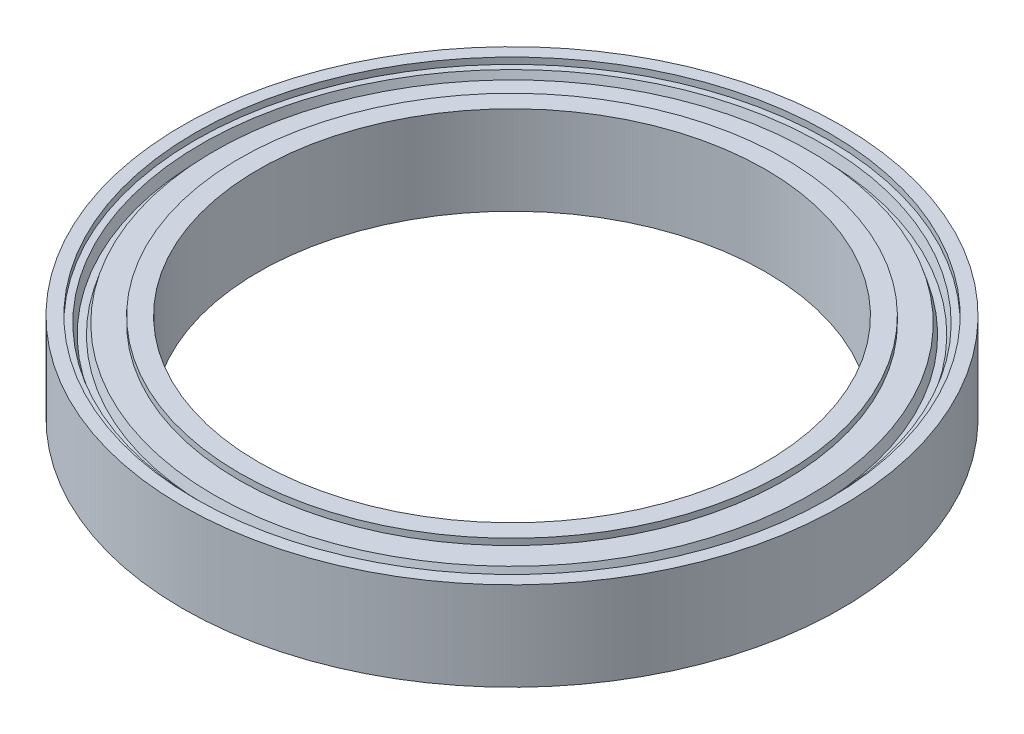
ISO-10303-21;
HEADER;
FILE_DESCRIPTION(('STEP AP214'),'2;1');
FILE_NAME('part.step','',(''),(''),'','','');
FILE_SCHEMA(('AUTOMOTIVE_DESIGN { 1 0 10303 214 1 1 1 1 }'));
ENDSEC;
DATA;
#1=APPLICATION_CONTEXT('core data for automotive mechanical design processes');
#2=APPLICATION_PROTOCOL_DEFINITION('international standard','automotive_design',2000,#1);
#3=PRODUCT_CONTEXT('',#1,'mechanical');
#4=PRODUCT('Part','Part','',(#3));
#5=PRODUCT_RELATED_PRODUCT_CATEGORY('part','',(#4));
#6=PRODUCT_DEFINITION_FORMATION('','',#4);
#7=PRODUCT_DEFINITION_CONTEXT('part definition',#1,'design');
#8=PRODUCT_DEFINITION('design','',#6,#7);
#9=PRODUCT_DEFINITION_SHAPE('','',#8);
#10=(LENGTH_UNIT() NAMED_UNIT(*) SI_UNIT(.MILLI.,.METRE.));
#11=(NAMED_UNIT(*) PLANE_ANGLE_UNIT() SI_UNIT($,.RADIAN.));
#12=(NAMED_UNIT(*) SI_UNIT($,.STERADIAN.) SOLID_ANGLE_UNIT());
#13=UNCERTAINTY_MEASURE_WITH_UNIT(LENGTH_MEASURE(1.E-05),#10,'distance_accuracy_value','');
#14=(GEOMETRIC_REPRESENTATION_CONTEXT(3) GLOBAL_UNCERTAINTY_ASSIGNED_CONTEXT((#13)) GLOBAL_UNIT_ASSIGNED_CONTEXT((#10,
#11,#12)) REPRESENTATION_CONTEXT('',''));
#15=CARTESIAN_POINT('',(0.,0.,0.));
#16=DIRECTION('',(0.,0.,1.));
#17=DIRECTION('',(1.,0.,0.));
#18=AXIS2_PLACEMENT_3D('',#15,#16,#17);
#19=CARTESIAN_POINT('',(0.,0.,0.));
#20=DIRECTION('',(0.,1.,0.));
#21=DIRECTION('',(0.,0.,1.));
#22=AXIS2_PLACEMENT_3D('',#19,#20,#21);
#23=PLANE('',#22);
#24=CARTESIAN_POINT('',(0.,0.,0.));
#25=DIRECTION('',(0.,1.,0.));
#26=DIRECTION('',(0.,0.,1.));
#27=AXIS2_PLACEMENT_3D('',#24,#25,#26);
#28=CIRCLE('',#27,20.);
#29=CARTESIAN_POINT('',(0.,0.,20.));
#30=VERTEX_POINT('',#29);
#31=EDGE_CURVE('E50',#30,#30,#28,.T.);
#32=ORIENTED_EDGE('',*,*,#31,.T.);
#33=EDGE_LOOP('',(#32));
#34=FACE_BOUND('',#33,.T.);
#35=CARTESIAN_POINT('',(0.,0.,0.));
#36=DIRECTION('',(0.,-1.,0.));
#37=DIRECTION('',(0.,0.,-1.));
#38=AXIS2_PLACEMENT_3D('',#35,#36,#37);
#39=CIRCLE('',#38,21.5);
#40=CARTESIAN_POINT('',(0.,0.,-21.5));
#41=VERTEX_POINT('',#40);
#42=EDGE_CURVE('E86',#41,#41,#39,.T.);
#43=ORIENTED_EDGE('',*,*,#42,.T.);
#44=EDGE_LOOP('',(#43));
#45=FACE_BOUND('',#44,.T.);
#46=ADVANCED_FACE('F37',(#34,#45),#23,.F.);
#47=CARTESIAN_POINT('',(0.,6.5,0.));
#48=DIRECTION('',(0.,1.,0.));
#49=DIRECTION('',(0.,0.,1.));
#50=AXIS2_PLACEMENT_3D('',#47,#48,#49);
#51=PLANE('',#50);
#52=CARTESIAN_POINT('',(0.,6.5,0.));
#53=DIRECTION('',(0.,1.,0.));
#54=DIRECTION('',(0.,0.,1.));
#55=AXIS2_PLACEMENT_3D('',#52,#53,#54);
#56=CIRCLE('',#55,21.5);
#57=CARTESIAN_POINT('',(0.,6.5,21.5));
#58=VERTEX_POINT('',#57);
#59=EDGE_CURVE('E59',#58,#58,#56,.T.);
#60=ORIENTED_EDGE('',*,*,#59,.F.);
#61=EDGE_LOOP('',(#60));
#62=FACE_BOUND('',#61,.T.);
#63=CARTESIAN_POINT('',(0.,6.5,0.));
#64=DIRECTION('',(0.,1.,0.));
#65=DIRECTION('',(0.,0.,1.));
#66=AXIS2_PLACEMENT_3D('',#63,#64,#65);
#67=CIRCLE('',#66,23.5);
#68=CARTESIAN_POINT('',(0.,6.5,23.5));
#69=VERTEX_POINT('',#68);
#70=EDGE_CURVE('E74',#69,#69,#67,.T.);
#71=ORIENTED_EDGE('',*,*,#70,.T.);
#72=EDGE_LOOP('',(#71));
#73=FACE_BOUND('',#72,.T.);
#74=ADVANCED_FACE('F125',(#62,#73),#51,.T.);
#75=CARTESIAN_POINT('',(0.,7.,0.));
#76=DIRECTION('',(0.,1.,0.));
#77=DIRECTION('',(0.,0.,1.));
#78=AXIS2_PLACEMENT_3D('',#75,#76,#77);
#79=PLANE('',#78);
#80=CARTESIAN_POINT('',(0.,7.,0.));
#81=DIRECTION('',(0.,1.,0.));
#82=DIRECTION('',(0.,0.,1.));
#83=AXIS2_PLACEMENT_3D('',#80,#81,#82);
#84=CIRCLE('',#83,20.);
#85=CARTESIAN_POINT('',(0.,7.,20.));
#86=VERTEX_POINT('',#85);
#87=EDGE_CURVE('E48',#86,#86,#84,.T.);
#88=ORIENTED_EDGE('',*,*,#87,.F.);
#89=EDGE_LOOP('',(#88));
#90=FACE_BOUND('',#89,.T.);
#91=CARTESIAN_POINT('',(0.,7.,0.));
#92=DIRECTION('',(0.,1.,0.));
#93=DIRECTION('',(0.,0.,1.));
#94=AXIS2_PLACEMENT_3D('',#91,#92,#93);
#95=CIRCLE('',#94,21.5);
#96=CARTESIAN_POINT('',(0.,7.,21.5));
#97=VERTEX_POINT('',#96);
#98=EDGE_CURVE('E62',#97,#97,#95,.T.);
#99=ORIENTED_EDGE('',*,*,#98,.T.);
#100=EDGE_LOOP('',(#99));
#101=FACE_BOUND('',#100,.T.);
#102=ADVANCED_FACE('F131',(#90,#101),#79,.T.);
#103=CARTESIAN_POINT('',(0.,7.,0.));
#104=DIRECTION('',(0.,1.,0.));
#105=DIRECTION('',(0.,0.,1.));
#106=AXIS2_PLACEMENT_3D('',#103,#104,#105);
#107=CIRCLE('',#106,25.);
#108=CARTESIAN_POINT('',(0.,7.,25.));
#109=VERTEX_POINT('',#108);
#110=EDGE_CURVE('E56',#109,#109,#107,.T.);
#111=ORIENTED_EDGE('',*,*,#110,.F.);
#112=EDGE_LOOP('',(#111));
#113=FACE_BOUND('',#112,.T.);
#114=CARTESIAN_POINT('',(0.,7.,0.));
#115=DIRECTION('',(0.,1.,0.));
#116=DIRECTION('',(0.,0.,1.));
#117=AXIS2_PLACEMENT_3D('',#114,#115,#116);
#118=CIRCLE('',#117,26.);
#119=CARTESIAN_POINT('',(0.,7.,26.));
#120=VERTEX_POINT('',#119);
#121=EDGE_CURVE('E10',#120,#120,#118,.T.);
#122=ORIENTED_EDGE('',*,*,#121,.T.);
#123=EDGE_LOOP('',(#122));
#124=FACE_BOUND('',#123,.T.);
#125=ADVANCED_FACE('F111',(#113,#124),#79,.T.);
#126=CARTESIAN_POINT('',(0.,0.,0.));
#127=DIRECTION('',(0.,-1.,0.));
#128=DIRECTION('',(0.,0.,-1.));
#129=AXIS2_PLACEMENT_3D('',#126,#127,#128);
#130=CIRCLE('',#129,24.5);
#131=CARTESIAN_POINT('',(0.,0.,-24.5));
#132=VERTEX_POINT('',#131);
#133=EDGE_CURVE('E80',#132,#132,#130,.T.);
#134=ORIENTED_EDGE('',*,*,#133,.F.);
#135=EDGE_LOOP('',(#134));
#136=FACE_BOUND('',#135,.T.);
#137=CARTESIAN_POINT('',(0.,0.,0.));
#138=DIRECTION('',(0.,1.,0.));
#139=DIRECTION('',(0.,0.,1.));
#140=AXIS2_PLACEMENT_3D('',#137,#138,#139);
#141=CIRCLE('',#140,26.);
#142=CARTESIAN_POINT('',(0.,0.,26.));
#143=VERTEX_POINT('',#142);
#144=EDGE_CURVE('E41',#143,#143,#141,.T.);
#145=ORIENTED_EDGE('',*,*,#144,.F.);
#146=EDGE_LOOP('',(#145));
#147=FACE_BOUND('',#146,.T.);
#148=ADVANCED_FACE('F108',(#136,#147),#23,.F.);
#149=CARTESIAN_POINT('',(0.,7.,0.));
#150=DIRECTION('',(0.,-1.,0.));
#151=DIRECTION('',(0.,0.,-1.));
#152=AXIS2_PLACEMENT_3D('',#149,#150,#151);
#153=CYLINDRICAL_SURFACE('',#152,26.);
#154=ORIENTED_EDGE('',*,*,#121,.F.);
#155=EDGE_LOOP('',(#154));
#156=FACE_BOUND('',#155,.T.);
#157=ORIENTED_EDGE('',*,*,#144,.T.);
#158=EDGE_LOOP('',(#157));
#159=FACE_BOUND('',#158,.T.);
#160=ADVANCED_FACE('F39',(#156,#159),#153,.T.);
#161=CARTESIAN_POINT('',(0.,7.,0.));
#162=DIRECTION('',(0.,-1.,0.));
#163=DIRECTION('',(0.,0.,-1.));
#164=AXIS2_PLACEMENT_3D('',#161,#162,#163);
#165=CYLINDRICAL_SURFACE('',#164,20.);
#166=ORIENTED_EDGE('',*,*,#87,.T.);
#167=EDGE_LOOP('',(#166));
#168=FACE_BOUND('',#167,.T.);
#169=ORIENTED_EDGE('',*,*,#31,.F.);
#170=EDGE_LOOP('',(#169));
#171=FACE_BOUND('',#170,.T.);
#172=ADVANCED_FACE('F115',(#168,#171),#165,.F.);
#173=CARTESIAN_POINT('',(0.,6.5,0.));
#174=DIRECTION('',(0.,1.,0.));
#175=DIRECTION('',(0.,0.,1.));
#176=AXIS2_PLACEMENT_3D('',#173,#174,#175);
#177=CYLINDRICAL_SURFACE('',#176,25.);
#178=CARTESIAN_POINT('',(0.,6.5,0.));
#179=DIRECTION('',(0.,1.,0.));
#180=DIRECTION('',(0.,0.,1.));
#181=AXIS2_PLACEMENT_3D('',#178,#179,#180);
#182=CIRCLE('',#181,25.);
#183=CARTESIAN_POINT('',(0.,6.5,25.));
#184=VERTEX_POINT('',#183);
#185=EDGE_CURVE('E53',#184,#184,#182,.T.);
#186=ORIENTED_EDGE('',*,*,#185,.F.);
#187=EDGE_LOOP('',(#186));
#188=FACE_BOUND('',#187,.T.);
#189=ORIENTED_EDGE('',*,*,#110,.T.);
#190=EDGE_LOOP('',(#189));
#191=FACE_BOUND('',#190,.T.);
#192=ADVANCED_FACE('F121',(#188,#191),#177,.F.);
#193=CARTESIAN_POINT('',(0.,6.5,0.));
#194=DIRECTION('',(0.,1.,0.));
#195=DIRECTION('',(0.,0.,1.));
#196=AXIS2_PLACEMENT_3D('',#193,#194,#195);
#197=CIRCLE('',#196,24.5);
#198=CARTESIAN_POINT('',(0.,6.5,24.5));
#199=VERTEX_POINT('',#198);
#200=EDGE_CURVE('E70',#199,#199,#197,.T.);
#201=ORIENTED_EDGE('',*,*,#200,.F.);
#202=EDGE_LOOP('',(#201));
#203=FACE_BOUND('',#202,.T.);
#204=ORIENTED_EDGE('',*,*,#185,.T.);
#205=EDGE_LOOP('',(#204));
#206=FACE_BOUND('',#205,.T.);
#207=ADVANCED_FACE('F134',(#203,#206),#51,.T.);
#208=CARTESIAN_POINT('',(0.,6.5,0.));
#209=DIRECTION('',(0.,1.,0.));
#210=DIRECTION('',(0.,0.,1.));
#211=AXIS2_PLACEMENT_3D('',#208,#209,#210);
#212=CYLINDRICAL_SURFACE('',#211,21.5);
#213=ORIENTED_EDGE('',*,*,#59,.T.);
#214=EDGE_LOOP('',(#213));
#215=FACE_BOUND('',#214,.T.);
#216=ORIENTED_EDGE('',*,*,#98,.F.);
#217=EDGE_LOOP('',(#216));
#218=FACE_BOUND('',#217,.T.);
#219=ADVANCED_FACE('F144',(#215,#218),#212,.T.);
#220=CARTESIAN_POINT('',(0.,6.5,0.));
#221=DIRECTION('',(0.,1.,0.));
#222=DIRECTION('',(0.,0.,1.));
#223=AXIS2_PLACEMENT_3D('',#220,#221,#222);
#224=CONICAL_SURFACE('',#223,24.5,0.296705972839036);
#225=CARTESIAN_POINT('',(0.,5.7,0.));
#226=DIRECTION('',(0.,1.,0.));
#227=DIRECTION('',(0.,0.,1.));
#228=AXIS2_PLACEMENT_3D('',#225,#226,#227);
#229=CIRCLE('',#228,24.2554154548331);
#230=CARTESIAN_POINT('',(0.,5.7,24.2554154548331));
#231=VERTEX_POINT('',#230);
#232=EDGE_CURVE('E65',#231,#231,#229,.T.);
#233=ORIENTED_EDGE('',*,*,#232,.F.);
#234=EDGE_LOOP('',(#233));
#235=FACE_BOUND('',#234,.T.);
#236=ORIENTED_EDGE('',*,*,#200,.T.);
#237=EDGE_LOOP('',(#236));
#238=FACE_BOUND('',#237,.T.);
#239=ADVANCED_FACE('F148',(#235,#238),#224,.F.);
#240=CARTESIAN_POINT('',(0.,5.7,0.));
#241=DIRECTION('',(0.,1.,0.));
#242=DIRECTION('',(0.,0.,1.));
#243=AXIS2_PLACEMENT_3D('',#240,#241,#242);
#244=PLANE('',#243);
#245=CARTESIAN_POINT('',(0.,5.7,0.));
#246=DIRECTION('',(0.,1.,0.));
#247=DIRECTION('',(0.,0.,1.));
#248=AXIS2_PLACEMENT_3D('',#245,#246,#247);
#249=CIRCLE('',#248,23.7445845451669);
#250=CARTESIAN_POINT('',(0.,5.7,23.7445845451669));
#251=VERTEX_POINT('',#250);
#252=EDGE_CURVE('E71',#251,#251,#249,.T.);
#253=ORIENTED_EDGE('',*,*,#252,.F.);
#254=EDGE_LOOP('',(#253));
#255=FACE_BOUND('',#254,.T.);
#256=ORIENTED_EDGE('',*,*,#232,.T.);
#257=EDGE_LOOP('',(#256));
#258=FACE_BOUND('',#257,.T.);
#259=ADVANCED_FACE('F152',(#255,#258),#244,.T.);
#260=CARTESIAN_POINT('',(0.,6.5,0.));
#261=DIRECTION('',(0.,-1.,0.));
#262=DIRECTION('',(0.,0.,1.));
#263=AXIS2_PLACEMENT_3D('',#260,#261,#262);
#264=CONICAL_SURFACE('',#263,23.5,0.296705972839036);
#265=ORIENTED_EDGE('',*,*,#252,.T.);
#266=EDGE_LOOP('',(#265));
#267=FACE_BOUND('',#266,.T.);
#268=ORIENTED_EDGE('',*,*,#70,.F.);
#269=EDGE_LOOP('',(#268));
#270=FACE_BOUND('',#269,.T.);
#271=ADVANCED_FACE('F104',(#267,#270),#264,.T.);
#272=CARTESIAN_POINT('',(0.,0.5,0.));
#273=DIRECTION('',(0.,-1.,0.));
#274=DIRECTION('',(0.,0.,-1.));
#275=AXIS2_PLACEMENT_3D('',#272,#273,#274);
#276=CYLINDRICAL_SURFACE('',#275,24.5);
#277=CARTESIAN_POINT('',(0.,0.5,0.));
#278=DIRECTION('',(0.,-1.,0.));
#279=DIRECTION('',(0.,0.,-1.));
#280=AXIS2_PLACEMENT_3D('',#277,#278,#279);
#281=CIRCLE('',#280,24.5);
#282=CARTESIAN_POINT('',(0.,0.5,-24.5));
#283=VERTEX_POINT('',#282);
#284=EDGE_CURVE('E79',#283,#283,#281,.T.);
#285=ORIENTED_EDGE('',*,*,#284,.F.);
#286=EDGE_LOOP('',(#285));
#287=FACE_BOUND('',#286,.T.);
#288=ORIENTED_EDGE('',*,*,#133,.T.);
#289=EDGE_LOOP('',(#288));
#290=FACE_BOUND('',#289,.T.);
#291=ADVANCED_FACE('F98',(#287,#290),#276,.F.);
#292=CARTESIAN_POINT('',(0.,0.5,0.));
#293=DIRECTION('',(0.,-1.,0.));
#294=DIRECTION('',(0.,0.,-1.));
#295=AXIS2_PLACEMENT_3D('',#292,#293,#294);
#296=PLANE('',#295);
#297=CARTESIAN_POINT('',(0.,0.5,0.));
#298=DIRECTION('',(0.,-1.,0.));
#299=DIRECTION('',(0.,0.,-1.));
#300=AXIS2_PLACEMENT_3D('',#297,#298,#299);
#301=CIRCLE('',#300,21.5);
#302=CARTESIAN_POINT('',(0.,0.5,-21.5));
#303=VERTEX_POINT('',#302);
#304=EDGE_CURVE('E83',#303,#303,#301,.T.);
#305=ORIENTED_EDGE('',*,*,#304,.F.);
#306=EDGE_LOOP('',(#305));
#307=FACE_BOUND('',#306,.T.);
#308=ORIENTED_EDGE('',*,*,#284,.T.);
#309=EDGE_LOOP('',(#308));
#310=FACE_BOUND('',#309,.T.);
#311=ADVANCED_FACE('F95',(#307,#310),#296,.T.);
#312=CARTESIAN_POINT('',(0.,0.5,0.));
#313=DIRECTION('',(0.,-1.,0.));
#314=DIRECTION('',(0.,0.,-1.));
#315=AXIS2_PLACEMENT_3D('',#312,#313,#314);
#316=CYLINDRICAL_SURFACE('',#315,21.5);
#317=ORIENTED_EDGE('',*,*,#304,.T.);
#318=EDGE_LOOP('',(#317));
#319=FACE_BOUND('',#318,.T.);
#320=ORIENTED_EDGE('',*,*,#42,.F.);
#321=EDGE_LOOP('',(#320));
#322=FACE_BOUND('',#321,.T.);
#323=ADVANCED_FACE('F92',(#319,#322),#316,.T.);
#324=CLOSED_SHELL('',(#46,#74,#102,#125,#148,#160,#172,#192,#207,#219,#239,#259,#271,#291,#311,#323));
#325=MANIFOLD_SOLID_BREP('B2',#324);
#326=ADVANCED_BREP_SHAPE_REPRESENTATION('',(#18,#325),#14);
#327=SHAPE_DEFINITION_REPRESENTATION(#9,#326);
ENDSEC;
END-ISO-10303-21;
